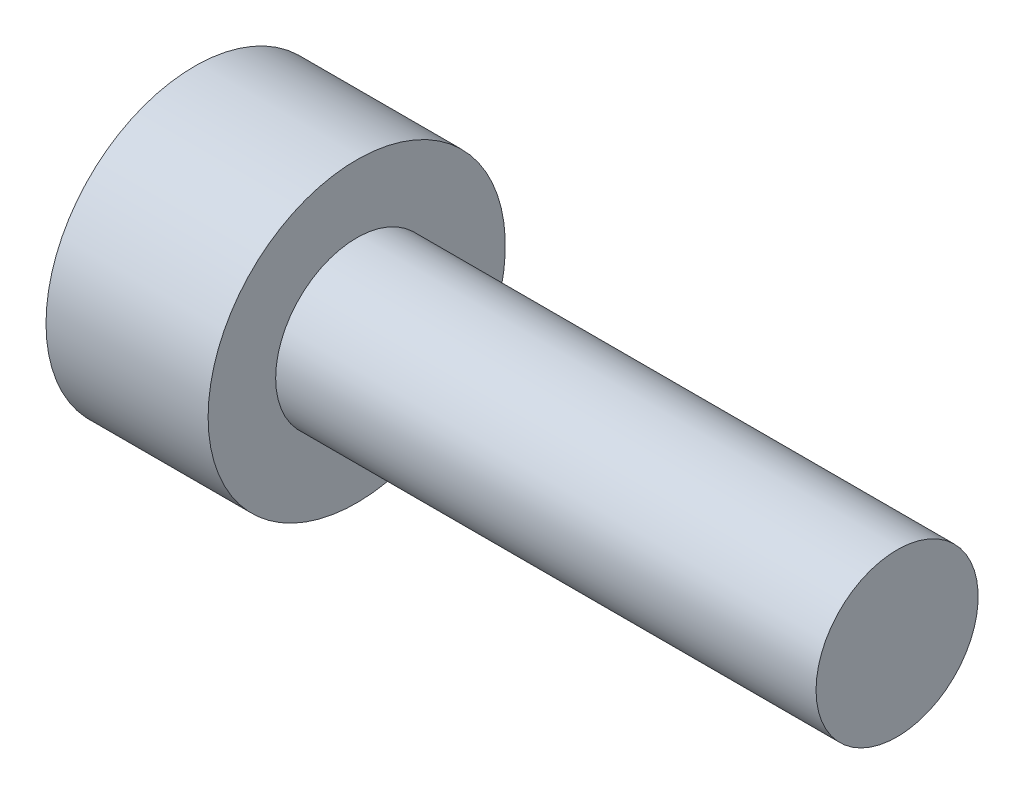
ISO-10303-21;
HEADER;
FILE_DESCRIPTION(('STEP AP214'),'2;1');
FILE_NAME('part.step','',(''),(''),'','','');
FILE_SCHEMA(('AUTOMOTIVE_DESIGN { 1 0 10303 214 1 1 1 1 }'));
ENDSEC;
DATA;
#1=APPLICATION_CONTEXT('core data for automotive mechanical design processes');
#2=APPLICATION_PROTOCOL_DEFINITION('international standard','automotive_design',2000,#1);
#3=PRODUCT_CONTEXT('',#1,'mechanical');
#4=PRODUCT('Part','Part','',(#3));
#5=PRODUCT_RELATED_PRODUCT_CATEGORY('part','',(#4));
#6=PRODUCT_DEFINITION_FORMATION('','',#4);
#7=PRODUCT_DEFINITION_CONTEXT('part definition',#1,'design');
#8=PRODUCT_DEFINITION('design','',#6,#7);
#9=PRODUCT_DEFINITION_SHAPE('','',#8);
#10=(LENGTH_UNIT() NAMED_UNIT(*) SI_UNIT(.MILLI.,.METRE.));
#11=(NAMED_UNIT(*) PLANE_ANGLE_UNIT() SI_UNIT($,.RADIAN.));
#12=(NAMED_UNIT(*) SI_UNIT($,.STERADIAN.) SOLID_ANGLE_UNIT());
#13=UNCERTAINTY_MEASURE_WITH_UNIT(LENGTH_MEASURE(1.E-05),#10,'distance_accuracy_value','');
#14=(GEOMETRIC_REPRESENTATION_CONTEXT(3) GLOBAL_UNCERTAINTY_ASSIGNED_CONTEXT((#13)) GLOBAL_UNIT_ASSIGNED_CONTEXT((#10,
#11,#12)) REPRESENTATION_CONTEXT('',''));
#15=CARTESIAN_POINT('',(0.,0.,0.));
#16=DIRECTION('',(0.,0.,1.));
#17=DIRECTION('',(1.,0.,0.));
#18=AXIS2_PLACEMENT_3D('',#15,#16,#17);
#19=CARTESIAN_POINT('',(-3.,0.,0.));
#20=DIRECTION('',(1.,0.,0.));
#21=DIRECTION('',(0.,0.,-1.));
#22=AXIS2_PLACEMENT_3D('',#19,#20,#21);
#23=PLANE('',#22);
#24=CARTESIAN_POINT('',(-3.,0.,0.));
#25=DIRECTION('',(-1.,0.,0.));
#26=DIRECTION('',(0.,0.,1.));
#27=AXIS2_PLACEMENT_3D('',#24,#25,#26);
#28=CIRCLE('',#27,2.75);
#29=CARTESIAN_POINT('',(-3.,0.,2.75));
#30=VERTEX_POINT('',#29);
#31=EDGE_CURVE('E11',#30,#30,#28,.T.);
#32=ORIENTED_EDGE('',*,*,#31,.T.);
#33=EDGE_LOOP('',(#32));
#34=FACE_BOUND('',#33,.T.);
#35=DIRECTION('',(0.,0.866025403784439,-0.5));
#36=VECTOR('',#35,1.);
#37=CARTESIAN_POINT('',(-3.,-1.25,-0.721687836487032));
#38=LINE('',#37,#36);
#39=CARTESIAN_POINT('',(-3.,-1.25,-0.721687836487032));
#40=VERTEX_POINT('',#39);
#41=CARTESIAN_POINT('',(-3.,0.,-1.44337567297406));
#42=VERTEX_POINT('',#41);
#43=EDGE_CURVE('E54',#40,#42,#38,.T.);
#44=ORIENTED_EDGE('',*,*,#43,.T.);
#45=DIRECTION('',(0.,0.866025403784439,0.5));
#46=VECTOR('',#45,1.);
#47=CARTESIAN_POINT('',(-3.,0.,-1.44337567297406));
#48=LINE('',#47,#46);
#49=CARTESIAN_POINT('',(-3.,1.25,-0.721687836487032));
#50=VERTEX_POINT('',#49);
#51=EDGE_CURVE('E129',#42,#50,#48,.T.);
#52=ORIENTED_EDGE('',*,*,#51,.T.);
#53=DIRECTION('',(0.,0.,1.));
#54=VECTOR('',#53,1.);
#55=CARTESIAN_POINT('',(-3.,1.25,-0.721687836487032));
#56=LINE('',#55,#54);
#57=CARTESIAN_POINT('',(-3.,1.25,0.721687836487032));
#58=VERTEX_POINT('',#57);
#59=EDGE_CURVE('E128',#50,#58,#56,.T.);
#60=ORIENTED_EDGE('',*,*,#59,.T.);
#61=DIRECTION('',(0.,-0.866025403784439,0.5));
#62=VECTOR('',#61,1.);
#63=CARTESIAN_POINT('',(-3.,1.25,0.721687836487032));
#64=LINE('',#63,#62);
#65=CARTESIAN_POINT('',(-3.,0.,1.44337567297406));
#66=VERTEX_POINT('',#65);
#67=EDGE_CURVE('E132',#58,#66,#64,.T.);
#68=ORIENTED_EDGE('',*,*,#67,.T.);
#69=DIRECTION('',(0.,-0.866025403784439,-0.5));
#70=VECTOR('',#69,1.);
#71=CARTESIAN_POINT('',(-3.,0.,1.44337567297406));
#72=LINE('',#71,#70);
#73=CARTESIAN_POINT('',(-3.,-1.25,0.721687836487033));
#74=VERTEX_POINT('',#73);
#75=EDGE_CURVE('E116',#66,#74,#72,.T.);
#76=ORIENTED_EDGE('',*,*,#75,.T.);
#77=DIRECTION('',(0.,0.,-1.));
#78=VECTOR('',#77,1.);
#79=CARTESIAN_POINT('',(-3.,-1.25,0.721687836487033));
#80=LINE('',#79,#78);
#81=EDGE_CURVE('E135',#74,#40,#80,.T.);
#82=ORIENTED_EDGE('',*,*,#81,.T.);
#83=EDGE_LOOP('',(#44,#52,#60,#68,#76,#82));
#84=FACE_BOUND('',#83,.T.);
#85=ADVANCED_FACE('F41',(#34,#84),#23,.F.);
#86=CARTESIAN_POINT('',(-1000.,0.,0.));
#87=DIRECTION('',(-1.,0.,0.));
#88=DIRECTION('',(0.,0.,1.));
#89=AXIS2_PLACEMENT_3D('',#86,#87,#88);
#90=CYLINDRICAL_SURFACE('',#89,2.75);
#91=ORIENTED_EDGE('',*,*,#31,.F.);
#92=EDGE_LOOP('',(#91));
#93=FACE_BOUND('',#92,.T.);
#94=CARTESIAN_POINT('',(0.,0.,0.));
#95=DIRECTION('',(-1.,0.,0.));
#96=DIRECTION('',(0.,0.,1.));
#97=AXIS2_PLACEMENT_3D('',#94,#95,#96);
#98=CIRCLE('',#97,2.75);
#99=CARTESIAN_POINT('',(0.,0.,2.75));
#100=VERTEX_POINT('',#99);
#101=EDGE_CURVE('E48',#100,#100,#98,.T.);
#102=ORIENTED_EDGE('',*,*,#101,.T.);
#103=EDGE_LOOP('',(#102));
#104=FACE_BOUND('',#103,.T.);
#105=ADVANCED_FACE('F153',(#93,#104),#90,.T.);
#106=CARTESIAN_POINT('',(0.,2.75,0.));
#107=DIRECTION('',(-1.,0.,0.));
#108=DIRECTION('',(0.,0.,1.));
#109=AXIS2_PLACEMENT_3D('',#106,#107,#108);
#110=PLANE('',#109);
#111=ORIENTED_EDGE('',*,*,#101,.F.);
#112=EDGE_LOOP('',(#111));
#113=FACE_BOUND('',#112,.T.);
#114=CARTESIAN_POINT('',(0.,0.,0.));
#115=DIRECTION('',(-1.,0.,0.));
#116=DIRECTION('',(0.,0.,1.));
#117=AXIS2_PLACEMENT_3D('',#114,#115,#116);
#118=CIRCLE('',#117,1.5);
#119=CARTESIAN_POINT('',(0.,0.,1.5));
#120=VERTEX_POINT('',#119);
#121=EDGE_CURVE('E148',#120,#120,#118,.T.);
#122=ORIENTED_EDGE('',*,*,#121,.T.);
#123=EDGE_LOOP('',(#122));
#124=FACE_BOUND('',#123,.T.);
#125=ADVANCED_FACE('F156',(#113,#124),#110,.F.);
#126=CARTESIAN_POINT('',(-1000.,0.,0.));
#127=DIRECTION('',(-1.,0.,0.));
#128=DIRECTION('',(0.,0.,1.));
#129=AXIS2_PLACEMENT_3D('',#126,#127,#128);
#130=CYLINDRICAL_SURFACE('',#129,1.5);
#131=ORIENTED_EDGE('',*,*,#121,.F.);
#132=EDGE_LOOP('',(#131));
#133=FACE_BOUND('',#132,.T.);
#134=CARTESIAN_POINT('',(10.,0.,0.));
#135=DIRECTION('',(-1.,0.,0.));
#136=DIRECTION('',(0.,0.,1.));
#137=AXIS2_PLACEMENT_3D('',#134,#135,#136);
#138=CIRCLE('',#137,1.5);
#139=CARTESIAN_POINT('',(10.,0.,1.5));
#140=VERTEX_POINT('',#139);
#141=EDGE_CURVE('E149',#140,#140,#138,.T.);
#142=ORIENTED_EDGE('',*,*,#141,.T.);
#143=EDGE_LOOP('',(#142));
#144=FACE_BOUND('',#143,.T.);
#145=ADVANCED_FACE('F158',(#133,#144),#130,.T.);
#146=CARTESIAN_POINT('',(10.,1.5,0.));
#147=DIRECTION('',(-1.,0.,0.));
#148=DIRECTION('',(0.,0.,1.));
#149=AXIS2_PLACEMENT_3D('',#146,#147,#148);
#150=PLANE('',#149);
#151=ORIENTED_EDGE('',*,*,#141,.F.);
#152=EDGE_LOOP('',(#151));
#153=FACE_BOUND('',#152,.T.);
#154=ADVANCED_FACE('F164',(#153),#150,.F.);
#155=CARTESIAN_POINT('',(-1.5,-1.25,-0.721687836487032));
#156=DIRECTION('',(0.,0.5,0.866025403784439));
#157=DIRECTION('',(0.,-0.866025403784439,0.5));
#158=AXIS2_PLACEMENT_3D('',#155,#156,#157);
#159=PLANE('',#158);
#160=ORIENTED_EDGE('',*,*,#43,.F.);
#161=DIRECTION('',(-1.,0.,0.));
#162=VECTOR('',#161,1.);
#163=CARTESIAN_POINT('',(-1.5,-1.25,-0.721687836487032));
#164=LINE('',#163,#162);
#165=CARTESIAN_POINT('',(-1.5,-1.25,-0.721687836487032));
#166=VERTEX_POINT('',#165);
#167=EDGE_CURVE('E122',#166,#40,#164,.T.);
#168=ORIENTED_EDGE('',*,*,#167,.F.);
#169=DIRECTION('',(0.,0.866025403784439,-0.5));
#170=VECTOR('',#169,1.);
#171=CARTESIAN_POINT('',(-1.5,-1.25,-0.721687836487032));
#172=LINE('',#171,#170);
#173=CARTESIAN_POINT('',(-1.5,0.,-1.44337567297406));
#174=VERTEX_POINT('',#173);
#175=EDGE_CURVE('E137',#166,#174,#172,.T.);
#176=ORIENTED_EDGE('',*,*,#175,.T.);
#177=DIRECTION('',(-1.,0.,0.));
#178=VECTOR('',#177,1.);
#179=CARTESIAN_POINT('',(-1.5,0.,-1.44337567297406));
#180=LINE('',#179,#178);
#181=EDGE_CURVE('E144',#174,#42,#180,.T.);
#182=ORIENTED_EDGE('',*,*,#181,.T.);
#183=EDGE_LOOP('',(#160,#168,#176,#182));
#184=FACE_BOUND('',#183,.T.);
#185=ADVANCED_FACE('F167',(#184),#159,.T.);
#186=CARTESIAN_POINT('',(-1.5,0.,-1.44337567297406));
#187=DIRECTION('',(0.,-0.5,0.866025403784439));
#188=DIRECTION('',(0.,-0.866025403784439,-0.5));
#189=AXIS2_PLACEMENT_3D('',#186,#187,#188);
#190=PLANE('',#189);
#191=ORIENTED_EDGE('',*,*,#51,.F.);
#192=ORIENTED_EDGE('',*,*,#181,.F.);
#193=DIRECTION('',(0.,0.866025403784439,0.5));
#194=VECTOR('',#193,1.);
#195=CARTESIAN_POINT('',(-1.5,0.,-1.44337567297406));
#196=LINE('',#195,#194);
#197=CARTESIAN_POINT('',(-1.5,1.25,-0.721687836487032));
#198=VERTEX_POINT('',#197);
#199=EDGE_CURVE('E93',#174,#198,#196,.T.);
#200=ORIENTED_EDGE('',*,*,#199,.T.);
#201=DIRECTION('',(-1.,0.,0.));
#202=VECTOR('',#201,1.);
#203=CARTESIAN_POINT('',(-1.5,1.25,-0.721687836487032));
#204=LINE('',#203,#202);
#205=EDGE_CURVE('E145',#198,#50,#204,.T.);
#206=ORIENTED_EDGE('',*,*,#205,.T.);
#207=EDGE_LOOP('',(#191,#192,#200,#206));
#208=FACE_BOUND('',#207,.T.);
#209=ADVANCED_FACE('F176',(#208),#190,.T.);
#210=CARTESIAN_POINT('',(-1.5,1.25,-0.721687836487032));
#211=DIRECTION('',(0.,-1.,0.));
#212=DIRECTION('',(0.,0.,-1.));
#213=AXIS2_PLACEMENT_3D('',#210,#211,#212);
#214=PLANE('',#213);
#215=ORIENTED_EDGE('',*,*,#59,.F.);
#216=ORIENTED_EDGE('',*,*,#205,.F.);
#217=DIRECTION('',(0.,0.,1.));
#218=VECTOR('',#217,1.);
#219=CARTESIAN_POINT('',(-1.5,1.25,-0.721687836487032));
#220=LINE('',#219,#218);
#221=CARTESIAN_POINT('',(-1.5,1.25,0.721687836487032));
#222=VERTEX_POINT('',#221);
#223=EDGE_CURVE('E115',#198,#222,#220,.T.);
#224=ORIENTED_EDGE('',*,*,#223,.T.);
#225=DIRECTION('',(-1.,0.,0.));
#226=VECTOR('',#225,1.);
#227=CARTESIAN_POINT('',(-1.5,1.25,0.721687836487032));
#228=LINE('',#227,#226);
#229=EDGE_CURVE('E107',#222,#58,#228,.T.);
#230=ORIENTED_EDGE('',*,*,#229,.T.);
#231=EDGE_LOOP('',(#215,#216,#224,#230));
#232=FACE_BOUND('',#231,.T.);
#233=ADVANCED_FACE('F191',(#232),#214,.T.);
#234=CARTESIAN_POINT('',(-1.5,1.25,0.721687836487032));
#235=DIRECTION('',(0.,-0.5,-0.866025403784438));
#236=DIRECTION('',(0.,0.866025403784439,-0.5));
#237=AXIS2_PLACEMENT_3D('',#234,#235,#236);
#238=PLANE('',#237);
#239=ORIENTED_EDGE('',*,*,#67,.F.);
#240=ORIENTED_EDGE('',*,*,#229,.F.);
#241=DIRECTION('',(0.,-0.866025403784439,0.5));
#242=VECTOR('',#241,1.);
#243=CARTESIAN_POINT('',(-1.5,1.25,0.721687836487032));
#244=LINE('',#243,#242);
#245=CARTESIAN_POINT('',(-1.5,0.,1.44337567297406));
#246=VERTEX_POINT('',#245);
#247=EDGE_CURVE('E104',#222,#246,#244,.T.);
#248=ORIENTED_EDGE('',*,*,#247,.T.);
#249=DIRECTION('',(-1.,0.,0.));
#250=VECTOR('',#249,1.);
#251=CARTESIAN_POINT('',(-1.5,0.,1.44337567297406));
#252=LINE('',#251,#250);
#253=EDGE_CURVE('E108',#246,#66,#252,.T.);
#254=ORIENTED_EDGE('',*,*,#253,.T.);
#255=EDGE_LOOP('',(#239,#240,#248,#254));
#256=FACE_BOUND('',#255,.T.);
#257=ADVANCED_FACE('F110',(#256),#238,.T.);
#258=CARTESIAN_POINT('',(-1.5,0.,1.44337567297406));
#259=DIRECTION('',(0.,0.5,-0.866025403784439));
#260=DIRECTION('',(0.,0.866025403784439,0.5));
#261=AXIS2_PLACEMENT_3D('',#258,#259,#260);
#262=PLANE('',#261);
#263=ORIENTED_EDGE('',*,*,#75,.F.);
#264=ORIENTED_EDGE('',*,*,#253,.F.);
#265=DIRECTION('',(0.,-0.866025403784439,-0.5));
#266=VECTOR('',#265,1.);
#267=CARTESIAN_POINT('',(-1.5,0.,1.44337567297406));
#268=LINE('',#267,#266);
#269=CARTESIAN_POINT('',(-1.5,-1.25,0.721687836487033));
#270=VERTEX_POINT('',#269);
#271=EDGE_CURVE('E111',#246,#270,#268,.T.);
#272=ORIENTED_EDGE('',*,*,#271,.T.);
#273=DIRECTION('',(-1.,0.,0.));
#274=VECTOR('',#273,1.);
#275=CARTESIAN_POINT('',(-1.5,-1.25,0.721687836487033));
#276=LINE('',#275,#274);
#277=EDGE_CURVE('E82',#270,#74,#276,.T.);
#278=ORIENTED_EDGE('',*,*,#277,.T.);
#279=EDGE_LOOP('',(#263,#264,#272,#278));
#280=FACE_BOUND('',#279,.T.);
#281=ADVANCED_FACE('F112',(#280),#262,.T.);
#282=CARTESIAN_POINT('',(-1.5,-1.25,0.721687836487033));
#283=DIRECTION('',(0.,1.,0.));
#284=DIRECTION('',(0.,0.,1.));
#285=AXIS2_PLACEMENT_3D('',#282,#283,#284);
#286=PLANE('',#285);
#287=ORIENTED_EDGE('',*,*,#81,.F.);
#288=ORIENTED_EDGE('',*,*,#277,.F.);
#289=DIRECTION('',(0.,0.,-1.));
#290=VECTOR('',#289,1.);
#291=CARTESIAN_POINT('',(-1.5,-1.25,0.721687836487033));
#292=LINE('',#291,#290);
#293=EDGE_CURVE('E65',#270,#166,#292,.T.);
#294=ORIENTED_EDGE('',*,*,#293,.T.);
#295=ORIENTED_EDGE('',*,*,#167,.T.);
#296=EDGE_LOOP('',(#287,#288,#294,#295));
#297=FACE_BOUND('',#296,.T.);
#298=ADVANCED_FACE('F184',(#297),#286,.T.);
#299=CARTESIAN_POINT('',(-1.5,0.,0.));
#300=DIRECTION('',(1.,0.,0.));
#301=DIRECTION('',(0.,0.,-1.));
#302=AXIS2_PLACEMENT_3D('',#299,#300,#301);
#303=PLANE('',#302);
#304=ORIENTED_EDGE('',*,*,#175,.F.);
#305=ORIENTED_EDGE('',*,*,#293,.F.);
#306=ORIENTED_EDGE('',*,*,#271,.F.);
#307=ORIENTED_EDGE('',*,*,#247,.F.);
#308=ORIENTED_EDGE('',*,*,#223,.F.);
#309=ORIENTED_EDGE('',*,*,#199,.F.);
#310=EDGE_LOOP('',(#304,#305,#306,#307,#308,#309));
#311=FACE_BOUND('',#310,.T.);
#312=ADVANCED_FACE('F118',(#311),#303,.F.);
#313=CLOSED_SHELL('',(#85,#105,#125,#145,#154,#185,#209,#233,#257,#281,#298,#312));
#314=MANIFOLD_SOLID_BREP('B2',#313);
#315=ADVANCED_BREP_SHAPE_REPRESENTATION('',(#18,#314),#14);
#316=SHAPE_DEFINITION_REPRESENTATION(#9,#315);
ENDSEC;
END-ISO-10303-21;
